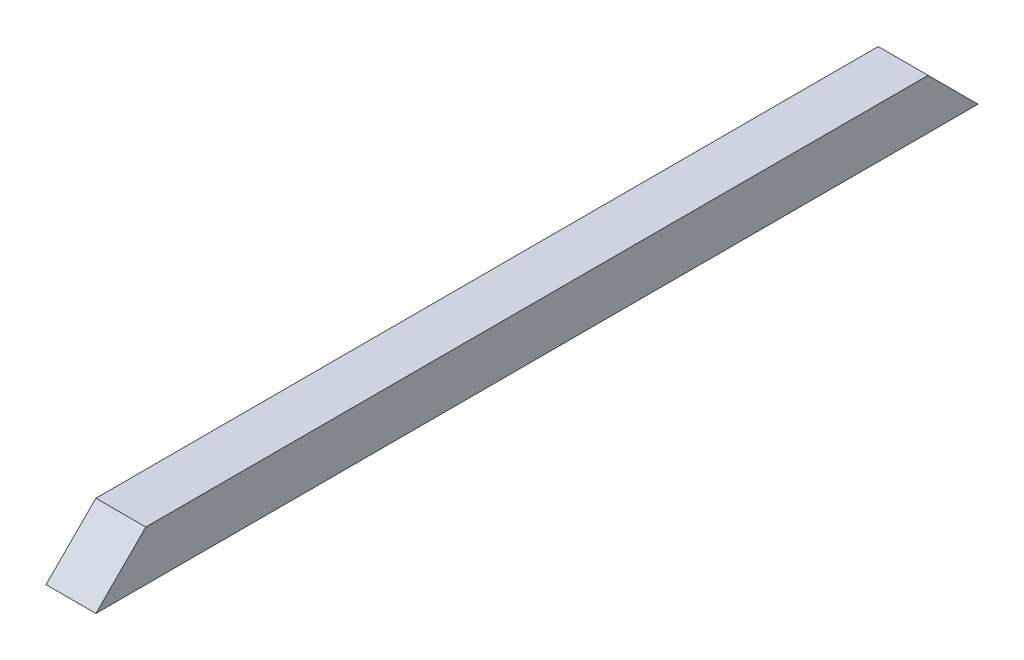
ISO-10303-21;
HEADER;
FILE_DESCRIPTION(('STEP AP214'),'2;1');
FILE_NAME('part.step','',(''),(''),'','','');
FILE_SCHEMA(('AUTOMOTIVE_DESIGN { 1 0 10303 214 1 1 1 1 }'));
ENDSEC;
DATA;
#1=APPLICATION_CONTEXT('core data for automotive mechanical design processes');
#2=APPLICATION_PROTOCOL_DEFINITION('international standard','automotive_design',2000,#1);
#3=PRODUCT_CONTEXT('',#1,'mechanical');
#4=PRODUCT('Part','Part','',(#3));
#5=PRODUCT_RELATED_PRODUCT_CATEGORY('part','',(#4));
#6=PRODUCT_DEFINITION_FORMATION('','',#4);
#7=PRODUCT_DEFINITION_CONTEXT('part definition',#1,'design');
#8=PRODUCT_DEFINITION('design','',#6,#7);
#9=PRODUCT_DEFINITION_SHAPE('','',#8);
#10=(LENGTH_UNIT() NAMED_UNIT(*) SI_UNIT(.MILLI.,.METRE.));
#11=(NAMED_UNIT(*) PLANE_ANGLE_UNIT() SI_UNIT($,.RADIAN.));
#12=(NAMED_UNIT(*) SI_UNIT($,.STERADIAN.) SOLID_ANGLE_UNIT());
#13=UNCERTAINTY_MEASURE_WITH_UNIT(LENGTH_MEASURE(1.E-05),#10,'distance_accuracy_value','');
#14=(GEOMETRIC_REPRESENTATION_CONTEXT(3) GLOBAL_UNCERTAINTY_ASSIGNED_CONTEXT((#13)) GLOBAL_UNIT_ASSIGNED_CONTEXT((#10,
#11,#12)) REPRESENTATION_CONTEXT('',''));
#15=CARTESIAN_POINT('',(0.,0.,0.));
#16=DIRECTION('',(0.,0.,1.));
#17=DIRECTION('',(1.,0.,0.));
#18=AXIS2_PLACEMENT_3D('',#15,#16,#17);
#19=CARTESIAN_POINT('',(0.,0.,600.));
#20=DIRECTION('',(1.,0.,0.));
#21=DIRECTION('',(0.,0.,-1.));
#22=AXIS2_PLACEMENT_3D('',#19,#20,#21);
#23=PLANE('',#22);
#24=DIRECTION('',(0.,0.,-1.));
#25=VECTOR('',#24,1.);
#26=CARTESIAN_POINT('',(0.,0.,600.));
#27=LINE('',#26,#25);
#28=CARTESIAN_POINT('',(0.,0.,580.));
#29=VERTEX_POINT('',#28);
#30=CARTESIAN_POINT('',(0.,0.,266.437273606536));
#31=VERTEX_POINT('',#30);
#32=EDGE_CURVE('E83',#29,#31,#27,.T.);
#33=ORIENTED_EDGE('',*,*,#32,.T.);
#34=DIRECTION('',(0.,-0.707271835631846,-0.706941688204875));
#35=VECTOR('',#34,1.);
#36=CARTESIAN_POINT('',(0.,0.,266.437273606536));
#37=LINE('',#36,#35);
#38=CARTESIAN_POINT('',(0.,-20.,246.446609406729));
#39=VERTEX_POINT('',#38);
#40=EDGE_CURVE('E46',#31,#39,#37,.T.);
#41=ORIENTED_EDGE('',*,*,#40,.T.);
#42=DIRECTION('',(0.,0.,-1.));
#43=VECTOR('',#42,1.);
#44=CARTESIAN_POINT('',(0.,-20.,600.));
#45=LINE('',#44,#43);
#46=CARTESIAN_POINT('',(0.,-20.,600.));
#47=VERTEX_POINT('',#46);
#48=EDGE_CURVE('E11',#47,#39,#45,.T.);
#49=ORIENTED_EDGE('',*,*,#48,.F.);
#50=DIRECTION('',(0.,0.707106781186543,-0.707106781186552));
#51=VECTOR('',#50,1.);
#52=CARTESIAN_POINT('',(0.,0.,580.));
#53=LINE('',#52,#51);
#54=EDGE_CURVE('E54',#47,#29,#53,.T.);
#55=ORIENTED_EDGE('',*,*,#54,.T.);
#56=EDGE_LOOP('',(#33,#41,#49,#55));
#57=FACE_BOUND('',#56,.T.);
#58=ADVANCED_FACE('F32',(#57),#23,.F.);
#59=CARTESIAN_POINT('',(0.,-20.,600.));
#60=DIRECTION('',(0.,1.,0.));
#61=DIRECTION('',(0.,0.,1.));
#62=AXIS2_PLACEMENT_3D('',#59,#60,#61);
#63=PLANE('',#62);
#64=ORIENTED_EDGE('',*,*,#48,.T.);
#65=DIRECTION('',(1.,0.,0.));
#66=VECTOR('',#65,1.);
#67=CARTESIAN_POINT('',(0.,-20.,246.446609406729));
#68=LINE('',#67,#66);
#69=CARTESIAN_POINT('',(20.,-20.,246.446609406729));
#70=VERTEX_POINT('',#69);
#71=EDGE_CURVE('E70',#39,#70,#68,.T.);
#72=ORIENTED_EDGE('',*,*,#71,.T.);
#73=DIRECTION('',(0.,0.,-1.));
#74=VECTOR('',#73,1.);
#75=CARTESIAN_POINT('',(20.,-20.,600.));
#76=LINE('',#75,#74);
#77=CARTESIAN_POINT('',(20.,-20.,600.));
#78=VERTEX_POINT('',#77);
#79=EDGE_CURVE('E39',#78,#70,#76,.T.);
#80=ORIENTED_EDGE('',*,*,#79,.F.);
#81=DIRECTION('',(1.,0.,0.));
#82=VECTOR('',#81,1.);
#83=CARTESIAN_POINT('',(0.,-20.,600.));
#84=LINE('',#83,#82);
#85=EDGE_CURVE('E86',#47,#78,#84,.T.);
#86=ORIENTED_EDGE('',*,*,#85,.F.);
#87=EDGE_LOOP('',(#64,#72,#80,#86));
#88=FACE_BOUND('',#87,.T.);
#89=ADVANCED_FACE('F85',(#88),#63,.F.);
#90=CARTESIAN_POINT('',(20.,0.,600.));
#91=DIRECTION('',(-1.,0.,0.));
#92=DIRECTION('',(0.,-1.,0.));
#93=AXIS2_PLACEMENT_3D('',#90,#91,#92);
#94=PLANE('',#93);
#95=ORIENTED_EDGE('',*,*,#79,.T.);
#96=DIRECTION('',(0.,0.707271835631846,0.706941688204876));
#97=VECTOR('',#96,1.);
#98=CARTESIAN_POINT('',(20.,166.78134501801,433.140766758898));
#99=LINE('',#98,#97);
#100=CARTESIAN_POINT('',(20.,0.,266.437273606536));
#101=VERTEX_POINT('',#100);
#102=EDGE_CURVE('E73',#70,#101,#99,.T.);
#103=ORIENTED_EDGE('',*,*,#102,.T.);
#104=DIRECTION('',(0.,0.,-1.));
#105=VECTOR('',#104,1.);
#106=CARTESIAN_POINT('',(20.,0.,600.));
#107=LINE('',#106,#105);
#108=CARTESIAN_POINT('',(20.,0.,580.));
#109=VERTEX_POINT('',#108);
#110=EDGE_CURVE('E90',#109,#101,#107,.T.);
#111=ORIENTED_EDGE('',*,*,#110,.F.);
#112=DIRECTION('',(0.,-0.707106781186543,0.707106781186552));
#113=VECTOR('',#112,1.);
#114=CARTESIAN_POINT('',(20.,-10.0000000000001,590.));
#115=LINE('',#114,#113);
#116=EDGE_CURVE('E88',#109,#78,#115,.T.);
#117=ORIENTED_EDGE('',*,*,#116,.T.);
#118=EDGE_LOOP('',(#95,#103,#111,#117));
#119=FACE_BOUND('',#118,.T.);
#120=ADVANCED_FACE('F98',(#119),#94,.F.);
#121=CARTESIAN_POINT('',(0.,0.,600.));
#122=DIRECTION('',(0.,-1.,0.));
#123=DIRECTION('',(0.,0.,-1.));
#124=AXIS2_PLACEMENT_3D('',#121,#122,#123);
#125=PLANE('',#124);
#126=ORIENTED_EDGE('',*,*,#110,.T.);
#127=DIRECTION('',(1.,0.,0.));
#128=VECTOR('',#127,1.);
#129=CARTESIAN_POINT('',(0.,0.,266.437273606536));
#130=LINE('',#129,#128);
#131=EDGE_CURVE('E77',#31,#101,#130,.T.);
#132=ORIENTED_EDGE('',*,*,#131,.F.);
#133=ORIENTED_EDGE('',*,*,#32,.F.);
#134=DIRECTION('',(1.,0.,0.));
#135=VECTOR('',#134,1.);
#136=CARTESIAN_POINT('',(0.,0.,580.));
#137=LINE('',#136,#135);
#138=EDGE_CURVE('E92',#29,#109,#137,.T.);
#139=ORIENTED_EDGE('',*,*,#138,.T.);
#140=EDGE_LOOP('',(#126,#132,#133,#139));
#141=FACE_BOUND('',#140,.T.);
#142=ADVANCED_FACE('F103',(#141),#125,.F.);
#143=CARTESIAN_POINT('',(0.,0.,580.));
#144=DIRECTION('',(0.,-0.707106781186552,-0.707106781186543));
#145=DIRECTION('',(0.,0.707106781186543,-0.707106781186552));
#146=AXIS2_PLACEMENT_3D('',#143,#144,#145);
#147=PLANE('',#146);
#148=ORIENTED_EDGE('',*,*,#138,.F.);
#149=ORIENTED_EDGE('',*,*,#54,.F.);
#150=ORIENTED_EDGE('',*,*,#85,.T.);
#151=ORIENTED_EDGE('',*,*,#116,.F.);
#152=EDGE_LOOP('',(#148,#149,#150,#151));
#153=FACE_BOUND('',#152,.T.);
#154=ADVANCED_FACE('F101',(#153),#147,.F.);
#155=CARTESIAN_POINT('',(0.,0.,266.437273606536));
#156=DIRECTION('',(0.,-0.706941688204876,0.707271835631846));
#157=DIRECTION('',(0.,-0.707271835631846,-0.706941688204876));
#158=AXIS2_PLACEMENT_3D('',#155,#156,#157);
#159=PLANE('',#158);
#160=ORIENTED_EDGE('',*,*,#71,.F.);
#161=ORIENTED_EDGE('',*,*,#40,.F.);
#162=ORIENTED_EDGE('',*,*,#131,.T.);
#163=ORIENTED_EDGE('',*,*,#102,.F.);
#164=EDGE_LOOP('',(#160,#161,#162,#163));
#165=FACE_BOUND('',#164,.T.);
#166=ADVANCED_FACE('F71',(#165),#159,.F.);
#167=CLOSED_SHELL('',(#58,#89,#120,#142,#154,#166));
#168=MANIFOLD_SOLID_BREP('B2',#167);
#169=ADVANCED_BREP_SHAPE_REPRESENTATION('',(#18,#168),#14);
#170=SHAPE_DEFINITION_REPRESENTATION(#9,#169);
ENDSEC;
END-ISO-10303-21;
